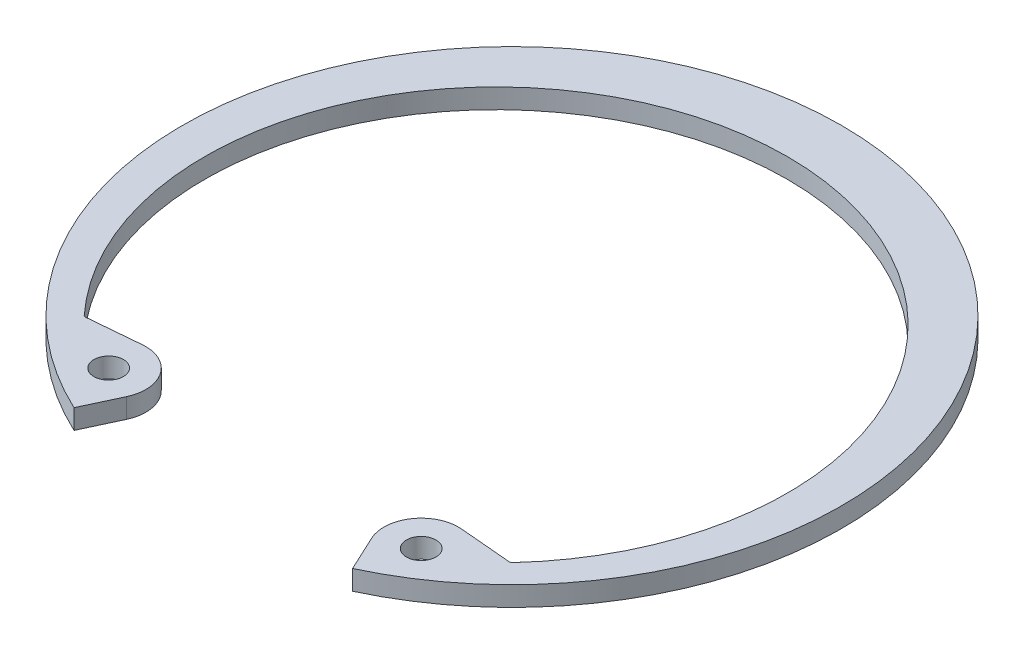
ISO-10303-21;
HEADER;
FILE_DESCRIPTION(('STEP AP214'),'2;1');
FILE_NAME('part.step','',(''),(''),'','','');
FILE_SCHEMA(('AUTOMOTIVE_DESIGN { 1 0 10303 214 1 1 1 1 }'));
ENDSEC;
DATA;
#1=APPLICATION_CONTEXT('core data for automotive mechanical design processes');
#2=APPLICATION_PROTOCOL_DEFINITION('international standard','automotive_design',2000,#1);
#3=PRODUCT_CONTEXT('',#1,'mechanical');
#4=PRODUCT('Part','Part','',(#3));
#5=PRODUCT_RELATED_PRODUCT_CATEGORY('part','',(#4));
#6=PRODUCT_DEFINITION_FORMATION('','',#4);
#7=PRODUCT_DEFINITION_CONTEXT('part definition',#1,'design');
#8=PRODUCT_DEFINITION('design','',#6,#7);
#9=PRODUCT_DEFINITION_SHAPE('','',#8);
#10=(LENGTH_UNIT() NAMED_UNIT(*) SI_UNIT(.MILLI.,.METRE.));
#11=(NAMED_UNIT(*) PLANE_ANGLE_UNIT() SI_UNIT($,.RADIAN.));
#12=(NAMED_UNIT(*) SI_UNIT($,.STERADIAN.) SOLID_ANGLE_UNIT());
#13=UNCERTAINTY_MEASURE_WITH_UNIT(LENGTH_MEASURE(1.E-05),#10,'distance_accuracy_value','');
#14=(GEOMETRIC_REPRESENTATION_CONTEXT(3) GLOBAL_UNCERTAINTY_ASSIGNED_CONTEXT((#13)) GLOBAL_UNIT_ASSIGNED_CONTEXT((#10,
#11,#12)) REPRESENTATION_CONTEXT('',''));
#15=CARTESIAN_POINT('',(0.,0.,0.));
#16=DIRECTION('',(0.,0.,1.));
#17=DIRECTION('',(1.,0.,0.));
#18=AXIS2_PLACEMENT_3D('',#15,#16,#17);
#19=CARTESIAN_POINT('',(12.4780997991866,-1.5748,19.7274935093524));
#20=DIRECTION('',(0.,1.,0.));
#21=DIRECTION('',(0.,0.,1.));
#22=AXIS2_PLACEMENT_3D('',#19,#20,#21);
#23=CYLINDRICAL_SURFACE('',#22,2.9718);
#24=CARTESIAN_POINT('',(12.4780997991866,0.,19.7274935093524));
#25=DIRECTION('',(0.,1.,0.));
#26=DIRECTION('',(0.,0.,-1.));
#27=AXIS2_PLACEMENT_3D('',#24,#25,#26);
#28=CIRCLE('',#27,2.9718);
#29=CARTESIAN_POINT('',(12.7371092354841,0.,16.7670021055633));
#30=VERTEX_POINT('',#29);
#31=CARTESIAN_POINT('',(9.78473431767108,0.,20.9834304595933));
#32=VERTEX_POINT('',#31);
#33=EDGE_CURVE('E156',#30,#32,#28,.T.);
#34=ORIENTED_EDGE('',*,*,#33,.F.);
#35=DIRECTION('',(0.,1.,0.));
#36=VECTOR('',#35,1.);
#37=CARTESIAN_POINT('',(12.7371092354841,-1.5748,16.7670021055633));
#38=LINE('',#37,#36);
#39=CARTESIAN_POINT('',(12.7371092354841,-1.5748,16.7670021055633));
#40=VERTEX_POINT('',#39);
#41=EDGE_CURVE('E133',#40,#30,#38,.T.);
#42=ORIENTED_EDGE('',*,*,#41,.F.);
#43=CARTESIAN_POINT('',(12.4780997991866,-1.5748,19.7274935093524));
#44=DIRECTION('',(0.,1.,0.));
#45=DIRECTION('',(0.,0.,-1.));
#46=AXIS2_PLACEMENT_3D('',#43,#44,#45);
#47=CIRCLE('',#46,2.9718);
#48=CARTESIAN_POINT('',(9.78473431767108,-1.5748,20.9834304595933));
#49=VERTEX_POINT('',#48);
#50=EDGE_CURVE('E126',#40,#49,#47,.T.);
#51=ORIENTED_EDGE('',*,*,#50,.T.);
#52=DIRECTION('',(0.,1.,0.));
#53=VECTOR('',#52,1.);
#54=CARTESIAN_POINT('',(9.78473431767108,-1.5748,20.9834304595933));
#55=LINE('',#54,#53);
#56=EDGE_CURVE('E109',#49,#32,#55,.T.);
#57=ORIENTED_EDGE('',*,*,#56,.T.);
#58=EDGE_LOOP('',(#34,#42,#51,#57));
#59=FACE_BOUND('',#58,.T.);
#60=ADVANCED_FACE('F34',(#59),#23,.T.);
#61=CARTESIAN_POINT('',(17.0190509218714,-1.5748,17.1416234610013));
#62=DIRECTION('',(0.0871557427476619,0.,-0.996194698091745));
#63=DIRECTION('',(-0.996194698091745,0.,-0.0871557427476619));
#64=AXIS2_PLACEMENT_3D('',#61,#62,#63);
#65=PLANE('',#64);
#66=DIRECTION('',(-0.996194698091745,0.,-0.0871557427476619));
#67=VECTOR('',#66,1.);
#68=CARTESIAN_POINT('',(17.0190509218714,0.,17.1416234610013));
#69=LINE('',#68,#67);
#70=CARTESIAN_POINT('',(16.895209366896,0.,17.1307887288675));
#71=VERTEX_POINT('',#70);
#72=EDGE_CURVE('E134',#71,#30,#69,.T.);
#73=ORIENTED_EDGE('',*,*,#72,.F.);
#74=DIRECTION('',(0.,-1.,0.));
#75=VECTOR('',#74,1.);
#76=CARTESIAN_POINT('',(16.895209366896,-1.5748,17.1307887288675));
#77=LINE('',#76,#75);
#78=CARTESIAN_POINT('',(16.895209366896,-1.5748,17.1307887288675));
#79=VERTEX_POINT('',#78);
#80=EDGE_CURVE('E49',#71,#79,#77,.T.);
#81=ORIENTED_EDGE('',*,*,#80,.T.);
#82=DIRECTION('',(-0.996194698091745,0.,-0.0871557427476619));
#83=VECTOR('',#82,1.);
#84=CARTESIAN_POINT('',(17.0190509218714,-1.5748,17.1416234610013));
#85=LINE('',#84,#83);
#86=EDGE_CURVE('E120',#79,#40,#85,.T.);
#87=ORIENTED_EDGE('',*,*,#86,.T.);
#88=ORIENTED_EDGE('',*,*,#41,.T.);
#89=EDGE_LOOP('',(#73,#81,#87,#88));
#90=FACE_BOUND('',#89,.T.);
#91=ADVANCED_FACE('F211',(#90),#65,.T.);
#92=CARTESIAN_POINT('',(0.,-1.5748,1.27295309508014));
#93=DIRECTION('',(0.,1.,0.));
#94=DIRECTION('',(0.,0.,1.));
#95=AXIS2_PLACEMENT_3D('',#92,#93,#94);
#96=CYLINDRICAL_SURFACE('',#95,23.2693530950801);
#97=CARTESIAN_POINT('',(0.,0.,1.27295309508014));
#98=DIRECTION('',(0.,-1.,0.));
#99=DIRECTION('',(0.,0.,1.));
#100=AXIS2_PLACEMENT_3D('',#97,#98,#99);
#101=CIRCLE('',#100,23.2693530950801);
#102=CARTESIAN_POINT('',(-17.104048650326,0.,17.0499716103382));
#103=VERTEX_POINT('',#102);
#104=CARTESIAN_POINT('',(17.1040486503261,0.,17.0499716103382));
#105=VERTEX_POINT('',#104);
#106=EDGE_CURVE('E136',#103,#105,#101,.T.);
#107=ORIENTED_EDGE('',*,*,#106,.F.);
#108=DIRECTION('',(0.,1.,0.));
#109=VECTOR('',#108,1.);
#110=CARTESIAN_POINT('',(-17.104048650326,-1.5748,17.0499716103382));
#111=LINE('',#110,#109);
#112=CARTESIAN_POINT('',(-17.104048650326,-1.5748,17.0499716103382));
#113=VERTEX_POINT('',#112);
#114=EDGE_CURVE('E187',#103,#113,#111,.F.);
#115=ORIENTED_EDGE('',*,*,#114,.T.);
#116=CARTESIAN_POINT('',(0.,-1.5748,1.27295309508014));
#117=DIRECTION('',(0.,-1.,0.));
#118=DIRECTION('',(0.,0.,1.));
#119=AXIS2_PLACEMENT_3D('',#116,#117,#118);
#120=CIRCLE('',#119,23.2693530950801);
#121=CARTESIAN_POINT('',(17.1040486503261,-1.5748,17.0499716103382));
#122=VERTEX_POINT('',#121);
#123=EDGE_CURVE('E152',#113,#122,#120,.T.);
#124=ORIENTED_EDGE('',*,*,#123,.T.);
#125=DIRECTION('',(0.,1.,0.));
#126=VECTOR('',#125,1.);
#127=CARTESIAN_POINT('',(17.1040486503261,-1.5748,17.0499716103382));
#128=LINE('',#127,#126);
#129=EDGE_CURVE('E184',#122,#105,#128,.T.);
#130=ORIENTED_EDGE('',*,*,#129,.T.);
#131=EDGE_LOOP('',(#107,#115,#124,#130));
#132=FACE_BOUND('',#131,.T.);
#133=ADVANCED_FACE('F207',(#132),#96,.F.);
#134=CARTESIAN_POINT('',(-17.0190509218714,-1.5748,17.1416234610013));
#135=DIRECTION('',(-0.0871557427476538,0.,-0.996194698091746));
#136=DIRECTION('',(-0.996194698091746,0.,0.0871557427476538));
#137=AXIS2_PLACEMENT_3D('',#134,#135,#136);
#138=PLANE('',#137);
#139=DIRECTION('',(-0.996194698091746,0.,0.0871557427476539));
#140=VECTOR('',#139,1.);
#141=CARTESIAN_POINT('',(-17.0190509218714,-1.5748,17.1416234610013));
#142=LINE('',#141,#140);
#143=CARTESIAN_POINT('',(-12.7371092354841,-1.5748,16.7670021055633));
#144=VERTEX_POINT('',#143);
#145=CARTESIAN_POINT('',(-16.895209366896,-1.5748,17.1307887288675));
#146=VERTEX_POINT('',#145);
#147=EDGE_CURVE('E149',#144,#146,#142,.T.);
#148=ORIENTED_EDGE('',*,*,#147,.T.);
#149=DIRECTION('',(0.,-1.,0.));
#150=VECTOR('',#149,1.);
#151=CARTESIAN_POINT('',(-16.895209366896,0.,17.1307887288675));
#152=LINE('',#151,#150);
#153=CARTESIAN_POINT('',(-16.895209366896,0.,17.1307887288675));
#154=VERTEX_POINT('',#153);
#155=EDGE_CURVE('E174',#146,#154,#152,.F.);
#156=ORIENTED_EDGE('',*,*,#155,.T.);
#157=DIRECTION('',(-0.996194698091746,0.,0.0871557427476539));
#158=VECTOR('',#157,1.);
#159=CARTESIAN_POINT('',(-17.0190509218714,0.,17.1416234610013));
#160=LINE('',#159,#158);
#161=CARTESIAN_POINT('',(-12.7371092354841,0.,16.7670021055633));
#162=VERTEX_POINT('',#161);
#163=EDGE_CURVE('E169',#162,#154,#160,.T.);
#164=ORIENTED_EDGE('',*,*,#163,.F.);
#165=DIRECTION('',(0.,1.,0.));
#166=VECTOR('',#165,1.);
#167=CARTESIAN_POINT('',(-12.7371092354841,-1.5748,16.7670021055633));
#168=LINE('',#167,#166);
#169=EDGE_CURVE('E175',#144,#162,#168,.T.);
#170=ORIENTED_EDGE('',*,*,#169,.F.);
#171=EDGE_LOOP('',(#148,#156,#164,#170));
#172=FACE_BOUND('',#171,.T.);
#173=ADVANCED_FACE('F201',(#172),#138,.T.);
#174=CARTESIAN_POINT('',(-12.4780997991866,-1.5748,19.7274935093524));
#175=DIRECTION('',(0.,1.,0.));
#176=DIRECTION('',(0.,0.,1.));
#177=AXIS2_PLACEMENT_3D('',#174,#175,#176);
#178=CYLINDRICAL_SURFACE('',#177,2.9718);
#179=CARTESIAN_POINT('',(-12.4780997991866,0.,19.7274935093524));
#180=DIRECTION('',(0.,1.,0.));
#181=DIRECTION('',(0.,0.,1.));
#182=AXIS2_PLACEMENT_3D('',#179,#180,#181);
#183=CIRCLE('',#182,2.9718);
#184=CARTESIAN_POINT('',(-9.78473431767108,0.,20.9834304595933));
#185=VERTEX_POINT('',#184);
#186=EDGE_CURVE('E166',#185,#162,#183,.T.);
#187=ORIENTED_EDGE('',*,*,#186,.F.);
#188=DIRECTION('',(0.,1.,0.));
#189=VECTOR('',#188,1.);
#190=CARTESIAN_POINT('',(-9.78473431767108,-1.5748,20.9834304595933));
#191=LINE('',#190,#189);
#192=CARTESIAN_POINT('',(-9.78473431767108,-1.5748,20.9834304595933));
#193=VERTEX_POINT('',#192);
#194=EDGE_CURVE('E177',#193,#185,#191,.T.);
#195=ORIENTED_EDGE('',*,*,#194,.F.);
#196=CARTESIAN_POINT('',(-12.4780997991866,-1.5748,19.7274935093524));
#197=DIRECTION('',(0.,1.,0.));
#198=DIRECTION('',(0.,0.,1.));
#199=AXIS2_PLACEMENT_3D('',#196,#197,#198);
#200=CIRCLE('',#199,2.9718);
#201=EDGE_CURVE('E146',#193,#144,#200,.T.);
#202=ORIENTED_EDGE('',*,*,#201,.T.);
#203=ORIENTED_EDGE('',*,*,#169,.T.);
#204=EDGE_LOOP('',(#187,#195,#202,#203));
#205=FACE_BOUND('',#204,.T.);
#206=ADVANCED_FACE('F220',(#205),#178,.T.);
#207=CARTESIAN_POINT('',(-11.1209459867493,-1.5748,23.8489456311973));
#208=DIRECTION('',(0.906307787036653,0.,0.422618261740694));
#209=DIRECTION('',(0.422618261740694,0.,-0.906307787036653));
#210=AXIS2_PLACEMENT_3D('',#207,#208,#209);
#211=PLANE('',#210);
#212=DIRECTION('',(0.422618261740694,0.,-0.906307787036653));
#213=VECTOR('',#212,1.);
#214=CARTESIAN_POINT('',(-11.1209459867493,0.,23.8489456311973));
#215=LINE('',#214,#213);
#216=CARTESIAN_POINT('',(-11.1209459867493,0.,23.8489456311973));
#217=VERTEX_POINT('',#216);
#218=EDGE_CURVE('E163',#217,#185,#215,.T.);
#219=ORIENTED_EDGE('',*,*,#218,.F.);
#220=DIRECTION('',(0.,1.,0.));
#221=VECTOR('',#220,1.);
#222=CARTESIAN_POINT('',(-11.1209459867493,-1.5748,23.8489456311973));
#223=LINE('',#222,#221);
#224=CARTESIAN_POINT('',(-11.1209459867493,-1.5748,23.8489456311973));
#225=VERTEX_POINT('',#224);
#226=EDGE_CURVE('E179',#225,#217,#223,.T.);
#227=ORIENTED_EDGE('',*,*,#226,.F.);
#228=DIRECTION('',(0.422618261740694,0.,-0.906307787036653));
#229=VECTOR('',#228,1.);
#230=CARTESIAN_POINT('',(-11.1209459867493,-1.5748,23.8489456311973));
#231=LINE('',#230,#229);
#232=EDGE_CURVE('E143',#225,#193,#231,.T.);
#233=ORIENTED_EDGE('',*,*,#232,.T.);
#234=ORIENTED_EDGE('',*,*,#194,.T.);
#235=EDGE_LOOP('',(#219,#227,#233,#234));
#236=FACE_BOUND('',#235,.T.);
#237=ADVANCED_FACE('F217',(#236),#211,.T.);
#238=CARTESIAN_POINT('',(0.,-1.5748,0.));
#239=DIRECTION('',(0.,1.,0.));
#240=DIRECTION('',(0.,0.,1.));
#241=AXIS2_PLACEMENT_3D('',#238,#239,#240);
#242=CYLINDRICAL_SURFACE('',#241,26.3144);
#243=CARTESIAN_POINT('',(0.,0.,0.));
#244=DIRECTION('',(0.,1.,0.));
#245=DIRECTION('',(0.,0.,1.));
#246=AXIS2_PLACEMENT_3D('',#243,#244,#245);
#247=CIRCLE('',#246,26.3144);
#248=CARTESIAN_POINT('',(11.1209459867493,0.,23.8489456311973));
#249=VERTEX_POINT('',#248);
#250=EDGE_CURVE('E160',#249,#217,#247,.T.);
#251=ORIENTED_EDGE('',*,*,#250,.F.);
#252=DIRECTION('',(0.,1.,0.));
#253=VECTOR('',#252,1.);
#254=CARTESIAN_POINT('',(11.1209459867493,-1.5748,23.8489456311973));
#255=LINE('',#254,#253);
#256=CARTESIAN_POINT('',(11.1209459867493,-1.5748,23.8489456311973));
#257=VERTEX_POINT('',#256);
#258=EDGE_CURVE('E119',#257,#249,#255,.T.);
#259=ORIENTED_EDGE('',*,*,#258,.F.);
#260=CARTESIAN_POINT('',(0.,-1.5748,0.));
#261=DIRECTION('',(0.,1.,0.));
#262=DIRECTION('',(0.,0.,1.));
#263=AXIS2_PLACEMENT_3D('',#260,#261,#262);
#264=CIRCLE('',#263,26.3144);
#265=EDGE_CURVE('E129',#257,#225,#264,.T.);
#266=ORIENTED_EDGE('',*,*,#265,.T.);
#267=ORIENTED_EDGE('',*,*,#226,.T.);
#268=EDGE_LOOP('',(#251,#259,#266,#267));
#269=FACE_BOUND('',#268,.T.);
#270=ADVANCED_FACE('F215',(#269),#242,.T.);
#271=CARTESIAN_POINT('',(11.1209459867493,-1.5748,23.8489456311973));
#272=DIRECTION('',(-0.906307787036653,0.,0.422618261740694));
#273=DIRECTION('',(0.422618261740694,0.,0.906307787036653));
#274=AXIS2_PLACEMENT_3D('',#271,#272,#273);
#275=PLANE('',#274);
#276=DIRECTION('',(0.422618261740694,0.,0.906307787036653));
#277=VECTOR('',#276,1.);
#278=CARTESIAN_POINT('',(11.1209459867493,0.,23.8489456311973));
#279=LINE('',#278,#277);
#280=EDGE_CURVE('E114',#32,#249,#279,.T.);
#281=ORIENTED_EDGE('',*,*,#280,.F.);
#282=ORIENTED_EDGE('',*,*,#56,.F.);
#283=DIRECTION('',(0.422618261740694,0.,0.906307787036653));
#284=VECTOR('',#283,1.);
#285=CARTESIAN_POINT('',(11.1209459867493,-1.5748,23.8489456311973));
#286=LINE('',#285,#284);
#287=EDGE_CURVE('E112',#49,#257,#286,.T.);
#288=ORIENTED_EDGE('',*,*,#287,.T.);
#289=ORIENTED_EDGE('',*,*,#258,.T.);
#290=EDGE_LOOP('',(#281,#282,#288,#289));
#291=FACE_BOUND('',#290,.T.);
#292=ADVANCED_FACE('F111',(#291),#275,.T.);
#293=CARTESIAN_POINT('',(12.4780997991866,-1.5748,19.7274935093524));
#294=DIRECTION('',(0.,-1.,0.));
#295=DIRECTION('',(0.,0.,-1.));
#296=AXIS2_PLACEMENT_3D('',#293,#294,#295);
#297=PLANE('',#296);
#298=CARTESIAN_POINT('',(-12.4780997991866,-1.5748,19.7274935093524));
#299=DIRECTION('',(0.,1.,0.));
#300=DIRECTION('',(0.,0.,1.));
#301=AXIS2_PLACEMENT_3D('',#298,#299,#300);
#302=CIRCLE('',#301,1.1811);
#303=CARTESIAN_POINT('',(-12.4780997991866,-1.5748,20.9085935093524));
#304=VERTEX_POINT('',#303);
#305=EDGE_CURVE('E361',#304,#304,#302,.T.);
#306=ORIENTED_EDGE('',*,*,#305,.T.);
#307=EDGE_LOOP('',(#306));
#308=FACE_BOUND('',#307,.T.);
#309=CARTESIAN_POINT('',(12.4780997991866,-1.5748,19.7274935093523));
#310=DIRECTION('',(0.,1.,0.));
#311=DIRECTION('',(0.,0.,1.));
#312=AXIS2_PLACEMENT_3D('',#309,#310,#311);
#313=CIRCLE('',#312,1.1811);
#314=CARTESIAN_POINT('',(12.4780997991866,-1.5748,20.9085935093524));
#315=VERTEX_POINT('',#314);
#316=EDGE_CURVE('E158',#315,#315,#313,.T.);
#317=ORIENTED_EDGE('',*,*,#316,.T.);
#318=EDGE_LOOP('',(#317));
#319=FACE_BOUND('',#318,.T.);
#320=ORIENTED_EDGE('',*,*,#50,.F.);
#321=ORIENTED_EDGE('',*,*,#86,.F.);
#322=CARTESIAN_POINT('',(16.9173469255539,-1.5748,16.8777552755522));
#323=DIRECTION('',(0.,-1.,0.));
#324=DIRECTION('',(0.,0.,-1.));
#325=AXIS2_PLACEMENT_3D('',#322,#323,#324);
#326=CIRCLE('',#325,0.254);
#327=EDGE_CURVE('E11',#79,#122,#326,.F.);
#328=ORIENTED_EDGE('',*,*,#327,.T.);
#329=ORIENTED_EDGE('',*,*,#123,.F.);
#330=CARTESIAN_POINT('',(-16.9173469255539,-1.5748,16.8777552755522));
#331=DIRECTION('',(0.,-1.,0.));
#332=DIRECTION('',(0.,0.,-1.));
#333=AXIS2_PLACEMENT_3D('',#330,#331,#332);
#334=CIRCLE('',#333,0.254);
#335=EDGE_CURVE('E192',#113,#146,#334,.F.);
#336=ORIENTED_EDGE('',*,*,#335,.T.);
#337=ORIENTED_EDGE('',*,*,#147,.F.);
#338=ORIENTED_EDGE('',*,*,#201,.F.);
#339=ORIENTED_EDGE('',*,*,#232,.F.);
#340=ORIENTED_EDGE('',*,*,#265,.F.);
#341=ORIENTED_EDGE('',*,*,#287,.F.);
#342=EDGE_LOOP('',(#320,#321,#328,#329,#336,#337,#338,#339,#340,#341));
#343=FACE_BOUND('',#342,.T.);
#344=ADVANCED_FACE('F125',(#308,#319,#343),#297,.T.);
#345=CARTESIAN_POINT('',(12.4780997991866,0.,19.7274935093524));
#346=DIRECTION('',(0.,-1.,0.));
#347=DIRECTION('',(0.,0.,-1.));
#348=AXIS2_PLACEMENT_3D('',#345,#346,#347);
#349=PLANE('',#348);
#350=CARTESIAN_POINT('',(-12.4780997991866,0.,19.7274935093524));
#351=DIRECTION('',(0.,1.,0.));
#352=DIRECTION('',(0.,0.,1.));
#353=AXIS2_PLACEMENT_3D('',#350,#351,#352);
#354=CIRCLE('',#353,1.1811);
#355=CARTESIAN_POINT('',(-12.4780997991866,0.,20.9085935093524));
#356=VERTEX_POINT('',#355);
#357=EDGE_CURVE('E357',#356,#356,#354,.T.);
#358=ORIENTED_EDGE('',*,*,#357,.F.);
#359=EDGE_LOOP('',(#358));
#360=FACE_BOUND('',#359,.T.);
#361=CARTESIAN_POINT('',(12.4780997991866,0.,19.7274935093523));
#362=DIRECTION('',(0.,1.,0.));
#363=DIRECTION('',(0.,0.,1.));
#364=AXIS2_PLACEMENT_3D('',#361,#362,#363);
#365=CIRCLE('',#364,1.1811);
#366=CARTESIAN_POINT('',(12.4780997991866,0.,20.9085935093524));
#367=VERTEX_POINT('',#366);
#368=EDGE_CURVE('E139',#367,#367,#365,.T.);
#369=ORIENTED_EDGE('',*,*,#368,.F.);
#370=EDGE_LOOP('',(#369));
#371=FACE_BOUND('',#370,.T.);
#372=ORIENTED_EDGE('',*,*,#33,.T.);
#373=ORIENTED_EDGE('',*,*,#280,.T.);
#374=ORIENTED_EDGE('',*,*,#250,.T.);
#375=ORIENTED_EDGE('',*,*,#218,.T.);
#376=ORIENTED_EDGE('',*,*,#186,.T.);
#377=ORIENTED_EDGE('',*,*,#163,.T.);
#378=CARTESIAN_POINT('',(-16.9173469255539,0.,16.8777552755522));
#379=DIRECTION('',(0.,-1.,0.));
#380=DIRECTION('',(0.,0.,-1.));
#381=AXIS2_PLACEMENT_3D('',#378,#379,#380);
#382=CIRCLE('',#381,0.254);
#383=EDGE_CURVE('E190',#154,#103,#382,.T.);
#384=ORIENTED_EDGE('',*,*,#383,.T.);
#385=ORIENTED_EDGE('',*,*,#106,.T.);
#386=CARTESIAN_POINT('',(16.9173469255539,0.,16.8777552755522));
#387=DIRECTION('',(0.,-1.,0.));
#388=DIRECTION('',(0.,0.,-1.));
#389=AXIS2_PLACEMENT_3D('',#386,#387,#388);
#390=CIRCLE('',#389,0.254);
#391=EDGE_CURVE('E42',#105,#71,#390,.T.);
#392=ORIENTED_EDGE('',*,*,#391,.T.);
#393=ORIENTED_EDGE('',*,*,#72,.T.);
#394=EDGE_LOOP('',(#372,#373,#374,#375,#376,#377,#384,#385,#392,#393));
#395=FACE_BOUND('',#394,.T.);
#396=ADVANCED_FACE('F205',(#360,#371,#395),#349,.F.);
#397=CARTESIAN_POINT('',(12.4780997991866,-1.5748,19.7274935093523));
#398=DIRECTION('',(0.,1.,0.));
#399=DIRECTION('',(0.,0.,1.));
#400=AXIS2_PLACEMENT_3D('',#397,#398,#399);
#401=CYLINDRICAL_SURFACE('',#400,1.1811);
#402=ORIENTED_EDGE('',*,*,#316,.F.);
#403=EDGE_LOOP('',(#402));
#404=FACE_BOUND('',#403,.T.);
#405=ORIENTED_EDGE('',*,*,#368,.T.);
#406=EDGE_LOOP('',(#405));
#407=FACE_BOUND('',#406,.T.);
#408=ADVANCED_FACE('F243',(#404,#407),#401,.F.);
#409=CARTESIAN_POINT('',(-12.4780997991866,-1.5748,19.7274935093524));
#410=DIRECTION('',(0.,1.,0.));
#411=DIRECTION('',(0.,0.,1.));
#412=AXIS2_PLACEMENT_3D('',#409,#410,#411);
#413=CYLINDRICAL_SURFACE('',#412,1.1811);
#414=ORIENTED_EDGE('',*,*,#305,.F.);
#415=EDGE_LOOP('',(#414));
#416=FACE_BOUND('',#415,.T.);
#417=ORIENTED_EDGE('',*,*,#357,.T.);
#418=EDGE_LOOP('',(#417));
#419=FACE_BOUND('',#418,.T.);
#420=ADVANCED_FACE('F238',(#416,#419),#413,.F.);
#421=CARTESIAN_POINT('',(-16.9173469255539,-1.5748,16.8777552755522));
#422=DIRECTION('',(0.,1.,0.));
#423=DIRECTION('',(0.,0.,1.));
#424=AXIS2_PLACEMENT_3D('',#421,#422,#423);
#425=CYLINDRICAL_SURFACE('',#424,0.254);
#426=ORIENTED_EDGE('',*,*,#335,.F.);
#427=ORIENTED_EDGE('',*,*,#114,.F.);
#428=ORIENTED_EDGE('',*,*,#383,.F.);
#429=ORIENTED_EDGE('',*,*,#155,.F.);
#430=EDGE_LOOP('',(#426,#427,#428,#429));
#431=FACE_BOUND('',#430,.T.);
#432=ADVANCED_FACE('F203',(#431),#425,.F.);
#433=CARTESIAN_POINT('',(16.9173469255539,-1.5748,16.8777552755522));
#434=DIRECTION('',(0.,1.,0.));
#435=DIRECTION('',(0.,0.,1.));
#436=AXIS2_PLACEMENT_3D('',#433,#434,#435);
#437=CYLINDRICAL_SURFACE('',#436,0.254);
#438=ORIENTED_EDGE('',*,*,#327,.F.);
#439=ORIENTED_EDGE('',*,*,#80,.F.);
#440=ORIENTED_EDGE('',*,*,#391,.F.);
#441=ORIENTED_EDGE('',*,*,#129,.F.);
#442=EDGE_LOOP('',(#438,#439,#440,#441));
#443=FACE_BOUND('',#442,.T.);
#444=ADVANCED_FACE('F36',(#443),#437,.F.);
#445=CLOSED_SHELL('',(#60,#91,#133,#173,#206,#237,#270,#292,#344,#396,#408,#420,#432,#444));
#446=MANIFOLD_SOLID_BREP('B2',#445);
#447=ADVANCED_BREP_SHAPE_REPRESENTATION('',(#18,#446),#14);
#448=SHAPE_DEFINITION_REPRESENTATION(#9,#447);
ENDSEC;
END-ISO-10303-21;
